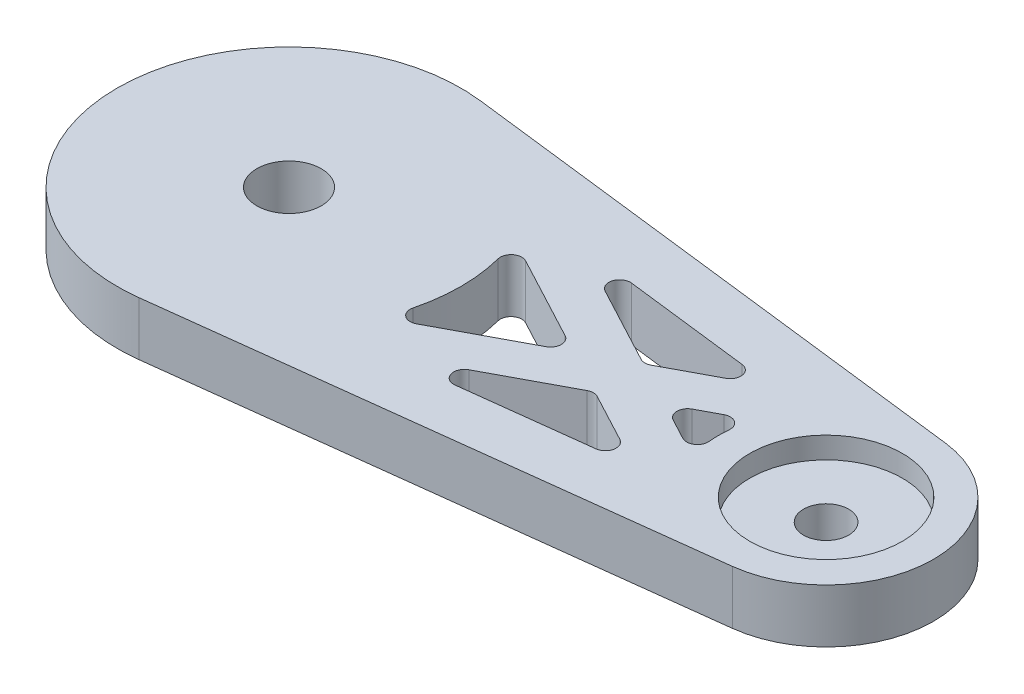
ISO-10303-21;
HEADER;
FILE_DESCRIPTION(('STEP AP214'),'2;1');
FILE_NAME('part.step','',(''),(''),'','','');
FILE_SCHEMA(('AUTOMOTIVE_DESIGN { 1 0 10303 214 1 1 1 1 }'));
ENDSEC;
DATA;
#1=APPLICATION_CONTEXT('core data for automotive mechanical design processes');
#2=APPLICATION_PROTOCOL_DEFINITION('international standard','automotive_design',2000,#1);
#3=PRODUCT_CONTEXT('',#1,'mechanical');
#4=PRODUCT('Part','Part','',(#3));
#5=PRODUCT_RELATED_PRODUCT_CATEGORY('part','',(#4));
#6=PRODUCT_DEFINITION_FORMATION('','',#4);
#7=PRODUCT_DEFINITION_CONTEXT('part definition',#1,'design');
#8=PRODUCT_DEFINITION('design','',#6,#7);
#9=PRODUCT_DEFINITION_SHAPE('','',#8);
#10=(LENGTH_UNIT() NAMED_UNIT(*) SI_UNIT(.MILLI.,.METRE.));
#11=(NAMED_UNIT(*) PLANE_ANGLE_UNIT() SI_UNIT($,.RADIAN.));
#12=(NAMED_UNIT(*) SI_UNIT($,.STERADIAN.) SOLID_ANGLE_UNIT());
#13=UNCERTAINTY_MEASURE_WITH_UNIT(LENGTH_MEASURE(1.E-05),#10,'distance_accuracy_value','');
#14=(GEOMETRIC_REPRESENTATION_CONTEXT(3) GLOBAL_UNCERTAINTY_ASSIGNED_CONTEXT((#13)) GLOBAL_UNIT_ASSIGNED_CONTEXT((#10,
#11,#12)) REPRESENTATION_CONTEXT('',''));
#15=CARTESIAN_POINT('',(0.,0.,0.));
#16=DIRECTION('',(0.,0.,1.));
#17=DIRECTION('',(1.,0.,0.));
#18=AXIS2_PLACEMENT_3D('',#15,#16,#17);
#19=CARTESIAN_POINT('',(1.92,5.,15.8843822668683));
#20=DIRECTION('',(-0.12,0.,-0.992773891679269));
#21=DIRECTION('',(-0.992773891679269,0.,0.12));
#22=AXIS2_PLACEMENT_3D('',#19,#20,#21);
#23=PLANE('',#22);
#24=DIRECTION('',(0.992773891679269,0.,-0.12));
#25=VECTOR('',#24,1.);
#26=CARTESIAN_POINT('',(1.92,0.,15.8843822668683));
#27=LINE('',#26,#25);
#28=CARTESIAN_POINT('',(1.92,0.,15.8843822668683));
#29=VERTEX_POINT('',#28);
#30=CARTESIAN_POINT('',(51.2,0.,9.92773891679268));
#31=VERTEX_POINT('',#30);
#32=EDGE_CURVE('E258',#29,#31,#27,.T.);
#33=ORIENTED_EDGE('',*,*,#32,.T.);
#34=DIRECTION('',(0.,-1.,0.));
#35=VECTOR('',#34,1.);
#36=CARTESIAN_POINT('',(51.2,5.,9.92773891679268));
#37=LINE('',#36,#35);
#38=CARTESIAN_POINT('',(51.2,5.,9.92773891679268));
#39=VERTEX_POINT('',#38);
#40=EDGE_CURVE('E237',#39,#31,#37,.T.);
#41=ORIENTED_EDGE('',*,*,#40,.F.);
#42=DIRECTION('',(0.992773891679269,0.,-0.12));
#43=VECTOR('',#42,1.);
#44=CARTESIAN_POINT('',(1.92,5.,15.8843822668683));
#45=LINE('',#44,#43);
#46=CARTESIAN_POINT('',(1.92,5.,15.8843822668683));
#47=VERTEX_POINT('',#46);
#48=EDGE_CURVE('E245',#47,#39,#45,.T.);
#49=ORIENTED_EDGE('',*,*,#48,.F.);
#50=DIRECTION('',(0.,-1.,0.));
#51=VECTOR('',#50,1.);
#52=CARTESIAN_POINT('',(1.92,5.,15.8843822668683));
#53=LINE('',#52,#51);
#54=EDGE_CURVE('E496',#47,#29,#53,.T.);
#55=ORIENTED_EDGE('',*,*,#54,.T.);
#56=EDGE_LOOP('',(#33,#41,#49,#55));
#57=FACE_BOUND('',#56,.T.);
#58=ADVANCED_FACE('F45',(#57),#23,.F.);
#59=CARTESIAN_POINT('',(50.,5.,0.));
#60=DIRECTION('',(0.,-1.,0.));
#61=DIRECTION('',(0.,0.,-1.));
#62=AXIS2_PLACEMENT_3D('',#59,#60,#61);
#63=CYLINDRICAL_SURFACE('',#62,10.);
#64=CARTESIAN_POINT('',(50.,0.,0.));
#65=DIRECTION('',(0.,1.,0.));
#66=DIRECTION('',(0.,0.,1.));
#67=AXIS2_PLACEMENT_3D('',#64,#65,#66);
#68=CIRCLE('',#67,10.);
#69=CARTESIAN_POINT('',(51.2,0.,-9.92773891679269));
#70=VERTEX_POINT('',#69);
#71=EDGE_CURVE('E545',#31,#70,#68,.T.);
#72=ORIENTED_EDGE('',*,*,#71,.T.);
#73=DIRECTION('',(0.,-1.,0.));
#74=VECTOR('',#73,1.);
#75=CARTESIAN_POINT('',(51.2,5.,-9.92773891679269));
#76=LINE('',#75,#74);
#77=CARTESIAN_POINT('',(51.2,5.,-9.92773891679269));
#78=VERTEX_POINT('',#77);
#79=EDGE_CURVE('E239',#78,#70,#76,.T.);
#80=ORIENTED_EDGE('',*,*,#79,.F.);
#81=CARTESIAN_POINT('',(50.,5.,0.));
#82=DIRECTION('',(0.,1.,0.));
#83=DIRECTION('',(0.,0.,1.));
#84=AXIS2_PLACEMENT_3D('',#81,#82,#83);
#85=CIRCLE('',#84,10.);
#86=EDGE_CURVE('E232',#39,#78,#85,.T.);
#87=ORIENTED_EDGE('',*,*,#86,.F.);
#88=ORIENTED_EDGE('',*,*,#40,.T.);
#89=EDGE_LOOP('',(#72,#80,#87,#88));
#90=FACE_BOUND('',#89,.T.);
#91=ADVANCED_FACE('F235',(#90),#63,.T.);
#92=CARTESIAN_POINT('',(1.92,5.,-15.8843822668683));
#93=DIRECTION('',(0.12,0.,-0.992773891679269));
#94=DIRECTION('',(-0.992773891679269,0.,-0.12));
#95=AXIS2_PLACEMENT_3D('',#92,#93,#94);
#96=PLANE('',#95);
#97=DIRECTION('',(0.992773891679269,0.,0.12));
#98=VECTOR('',#97,1.);
#99=CARTESIAN_POINT('',(1.92,0.,-15.8843822668683));
#100=LINE('',#99,#98);
#101=CARTESIAN_POINT('',(1.92,0.,-15.8843822668683));
#102=VERTEX_POINT('',#101);
#103=EDGE_CURVE('E548',#102,#70,#100,.T.);
#104=ORIENTED_EDGE('',*,*,#103,.F.);
#105=DIRECTION('',(0.,-1.,0.));
#106=VECTOR('',#105,1.);
#107=CARTESIAN_POINT('',(1.92,5.,-15.8843822668683));
#108=LINE('',#107,#106);
#109=CARTESIAN_POINT('',(1.92,5.,-15.8843822668683));
#110=VERTEX_POINT('',#109);
#111=EDGE_CURVE('E267',#110,#102,#108,.T.);
#112=ORIENTED_EDGE('',*,*,#111,.F.);
#113=DIRECTION('',(0.992773891679269,0.,0.12));
#114=VECTOR('',#113,1.);
#115=CARTESIAN_POINT('',(1.92,5.,-15.8843822668683));
#116=LINE('',#115,#114);
#117=EDGE_CURVE('E244',#110,#78,#116,.T.);
#118=ORIENTED_EDGE('',*,*,#117,.T.);
#119=ORIENTED_EDGE('',*,*,#79,.T.);
#120=EDGE_LOOP('',(#104,#112,#118,#119));
#121=FACE_BOUND('',#120,.T.);
#122=ADVANCED_FACE('F564',(#121),#96,.T.);
#123=CARTESIAN_POINT('',(5.85509273194591,5.,10.9895441071888));
#124=DIRECTION('',(-0.470213208590282,0.,-0.882552853072966));
#125=DIRECTION('',(-0.882552853072966,0.,0.470213208590282));
#126=AXIS2_PLACEMENT_3D('',#123,#124,#125);
#127=PLANE('',#126);
#128=DIRECTION('',(0.882552853072966,0.,-0.470213208590282));
#129=VECTOR('',#128,1.);
#130=CARTESIAN_POINT('',(5.85509273194591,0.,10.9895441071888));
#131=LINE('',#130,#129);
#132=CARTESIAN_POINT('',(31.2051972154841,0.,-2.51667699424358));
#133=VERTEX_POINT('',#132);
#134=CARTESIAN_POINT('',(35.7312644808302,0.,-4.92810946961721));
#135=VERTEX_POINT('',#134);
#136=EDGE_CURVE('E531',#133,#135,#131,.T.);
#137=ORIENTED_EDGE('',*,*,#136,.F.);
#138=DIRECTION('',(0.,-1.,0.));
#139=VECTOR('',#138,1.);
#140=CARTESIAN_POINT('',(31.2051972154841,5.,-2.51667699424358));
#141=LINE('',#140,#139);
#142=CARTESIAN_POINT('',(31.2051972154841,5.,-2.51667699424358));
#143=VERTEX_POINT('',#142);
#144=EDGE_CURVE('E366',#133,#143,#141,.F.);
#145=ORIENTED_EDGE('',*,*,#144,.T.);
#146=DIRECTION('',(0.882552853072966,0.,-0.470213208590282));
#147=VECTOR('',#146,1.);
#148=CARTESIAN_POINT('',(5.85509273194591,5.,10.9895441071888));
#149=LINE('',#148,#147);
#150=CARTESIAN_POINT('',(35.7312644808302,5.,-4.92810946961721));
#151=VERTEX_POINT('',#150);
#152=EDGE_CURVE('E477',#143,#151,#149,.T.);
#153=ORIENTED_EDGE('',*,*,#152,.T.);
#154=DIRECTION('',(0.,-1.,0.));
#155=VECTOR('',#154,1.);
#156=CARTESIAN_POINT('',(35.7312644808302,5.,-4.9281094696172));
#157=LINE('',#156,#155);
#158=EDGE_CURVE('E362',#151,#135,#157,.T.);
#159=ORIENTED_EDGE('',*,*,#158,.T.);
#160=EDGE_LOOP('',(#137,#145,#153,#159));
#161=FACE_BOUND('',#160,.T.);
#162=ADVANCED_FACE('F566',(#161),#127,.T.);
#163=CARTESIAN_POINT('',(7.73594556630704,5.,-14.5197555194806));
#164=DIRECTION('',(0.470213208590282,0.,-0.882552853072966));
#165=DIRECTION('',(-0.882552853072966,0.,-0.470213208590282));
#166=AXIS2_PLACEMENT_3D('',#163,#164,#165);
#167=PLANE('',#166);
#168=DIRECTION('',(0.882552853072966,0.,0.470213208590282));
#169=VECTOR('',#168,1.);
#170=CARTESIAN_POINT('',(7.73594556630704,0.,-14.5197555194806));
#171=LINE('',#170,#169);
#172=CARTESIAN_POINT('',(23.0824153449946,0.,-6.3433468544985));
#173=VERTEX_POINT('',#172);
#174=CARTESIAN_POINT('',(30.2647707983036,0.,-2.51667699424358));
#175=VERTEX_POINT('',#174);
#176=EDGE_CURVE('E535',#173,#175,#171,.T.);
#177=ORIENTED_EDGE('',*,*,#176,.F.);
#178=DIRECTION('',(0.,-1.,0.));
#179=VECTOR('',#178,1.);
#180=CARTESIAN_POINT('',(23.0824153449946,5.,-6.3433468544985));
#181=LINE('',#180,#179);
#182=CARTESIAN_POINT('',(23.0824153449946,5.,-6.3433468544985));
#183=VERTEX_POINT('',#182);
#184=EDGE_CURVE('E359',#173,#183,#181,.F.);
#185=ORIENTED_EDGE('',*,*,#184,.T.);
#186=DIRECTION('',(0.882552853072966,0.,0.470213208590282));
#187=VECTOR('',#186,1.);
#188=CARTESIAN_POINT('',(7.73594556630704,5.,-14.5197555194806));
#189=LINE('',#188,#187);
#190=CARTESIAN_POINT('',(30.2647707983036,5.,-2.51667699424358));
#191=VERTEX_POINT('',#190);
#192=EDGE_CURVE('E481',#183,#191,#189,.T.);
#193=ORIENTED_EDGE('',*,*,#192,.T.);
#194=DIRECTION('',(0.,-1.,0.));
#195=VECTOR('',#194,1.);
#196=CARTESIAN_POINT('',(30.2647707983036,0.,-2.51667699424358));
#197=LINE('',#196,#195);
#198=EDGE_CURVE('E355',#191,#175,#197,.T.);
#199=ORIENTED_EDGE('',*,*,#198,.T.);
#200=EDGE_LOOP('',(#177,#185,#193,#199));
#201=FACE_BOUND('',#200,.T.);
#202=ADVANCED_FACE('F572',(#201),#167,.T.);
#203=CARTESIAN_POINT('',(7.73594556630704,5.,14.5197555194806));
#204=DIRECTION('',(-0.470213208590282,0.,-0.882552853072966));
#205=DIRECTION('',(-0.882552853072966,0.,0.470213208590282));
#206=AXIS2_PLACEMENT_3D('',#203,#204,#205);
#207=PLANE('',#206);
#208=DIRECTION('',(0.882552853072966,0.,-0.470213208590282));
#209=VECTOR('',#208,1.);
#210=CARTESIAN_POINT('',(7.73594556630704,0.,14.5197555194806));
#211=LINE('',#210,#209);
#212=CARTESIAN_POINT('',(23.0824153449946,0.,6.3433468544985));
#213=VERTEX_POINT('',#212);
#214=CARTESIAN_POINT('',(30.2647707983036,0.,2.51667699424358));
#215=VERTEX_POINT('',#214);
#216=EDGE_CURVE('E519',#213,#215,#211,.T.);
#217=ORIENTED_EDGE('',*,*,#216,.T.);
#218=DIRECTION('',(0.,-1.,0.));
#219=VECTOR('',#218,1.);
#220=CARTESIAN_POINT('',(30.2647707983036,5.,2.51667699424359));
#221=LINE('',#220,#219);
#222=CARTESIAN_POINT('',(30.2647707983036,5.,2.51667699424358));
#223=VERTEX_POINT('',#222);
#224=EDGE_CURVE('E320',#215,#223,#221,.F.);
#225=ORIENTED_EDGE('',*,*,#224,.T.);
#226=DIRECTION('',(0.882552853072966,0.,-0.470213208590282));
#227=VECTOR('',#226,1.);
#228=CARTESIAN_POINT('',(7.73594556630704,5.,14.5197555194806));
#229=LINE('',#228,#227);
#230=CARTESIAN_POINT('',(23.0824153449946,5.,6.3433468544985));
#231=VERTEX_POINT('',#230);
#232=EDGE_CURVE('E465',#231,#223,#229,.T.);
#233=ORIENTED_EDGE('',*,*,#232,.F.);
#234=DIRECTION('',(0.,-1.,0.));
#235=VECTOR('',#234,1.);
#236=CARTESIAN_POINT('',(23.0824153449946,5.,6.3433468544985));
#237=LINE('',#236,#235);
#238=EDGE_CURVE('E316',#231,#213,#237,.T.);
#239=ORIENTED_EDGE('',*,*,#238,.T.);
#240=EDGE_LOOP('',(#217,#225,#233,#239));
#241=FACE_BOUND('',#240,.T.);
#242=ADVANCED_FACE('F592',(#241),#207,.F.);
#243=CARTESIAN_POINT('',(5.85509273194591,5.,-10.9895441071887));
#244=DIRECTION('',(0.470213208590282,0.,-0.882552853072966));
#245=DIRECTION('',(-0.882552853072966,0.,-0.470213208590282));
#246=AXIS2_PLACEMENT_3D('',#243,#244,#245);
#247=PLANE('',#246);
#248=DIRECTION('',(0.882552853072966,0.,0.470213208590282));
#249=VECTOR('',#248,1.);
#250=CARTESIAN_POINT('',(5.85509273194591,5.,-10.9895441071887));
#251=LINE('',#250,#249);
#252=CARTESIAN_POINT('',(31.2051972154841,5.,2.51667699424359));
#253=VERTEX_POINT('',#252);
#254=CARTESIAN_POINT('',(35.7312644808301,5.,4.9281094696172));
#255=VERTEX_POINT('',#254);
#256=EDGE_CURVE('E469',#253,#255,#251,.T.);
#257=ORIENTED_EDGE('',*,*,#256,.F.);
#258=DIRECTION('',(0.,-1.,0.));
#259=VECTOR('',#258,1.);
#260=CARTESIAN_POINT('',(31.2051972154841,0.,2.51667699424358));
#261=LINE('',#260,#259);
#262=CARTESIAN_POINT('',(31.2051972154841,0.,2.51667699424359));
#263=VERTEX_POINT('',#262);
#264=EDGE_CURVE('E312',#253,#263,#261,.T.);
#265=ORIENTED_EDGE('',*,*,#264,.T.);
#266=DIRECTION('',(0.882552853072966,0.,0.470213208590282));
#267=VECTOR('',#266,1.);
#268=CARTESIAN_POINT('',(5.85509273194591,0.,-10.9895441071887));
#269=LINE('',#268,#267);
#270=CARTESIAN_POINT('',(35.7312644808301,0.,4.9281094696172));
#271=VERTEX_POINT('',#270);
#272=EDGE_CURVE('E523',#263,#271,#269,.T.);
#273=ORIENTED_EDGE('',*,*,#272,.T.);
#274=DIRECTION('',(0.,-1.,0.));
#275=VECTOR('',#274,1.);
#276=CARTESIAN_POINT('',(35.7312644808301,5.,4.9281094696172));
#277=LINE('',#276,#275);
#278=EDGE_CURVE('E309',#271,#255,#277,.F.);
#279=ORIENTED_EDGE('',*,*,#278,.T.);
#280=EDGE_LOOP('',(#257,#265,#273,#279));
#281=FACE_BOUND('',#280,.T.);
#282=ADVANCED_FACE('F599',(#281),#247,.F.);
#283=CARTESIAN_POINT('',(7.73594556630702,5.,14.5197555194806));
#284=DIRECTION('',(-0.470213208590281,0.,-0.882552853072966));
#285=DIRECTION('',(-0.882552853072966,0.,0.470213208590281));
#286=AXIS2_PLACEMENT_3D('',#283,#284,#285);
#287=PLANE('',#286);
#288=DIRECTION('',(0.882552853072966,0.,-0.470213208590281));
#289=VECTOR('',#288,1.);
#290=CARTESIAN_POINT('',(7.73594556630702,5.,14.5197555194806));
#291=LINE('',#290,#289);
#292=CARTESIAN_POINT('',(36.6448552901751,5.,-0.882552853072977));
#293=VERTEX_POINT('',#292);
#294=CARTESIAN_POINT('',(38.5781173840263,5.,-1.91257090698391));
#295=VERTEX_POINT('',#294);
#296=EDGE_CURVE('E448',#293,#295,#291,.T.);
#297=ORIENTED_EDGE('',*,*,#296,.F.);
#298=DIRECTION('',(0.,-1.,0.));
#299=VECTOR('',#298,1.);
#300=CARTESIAN_POINT('',(36.6448552901751,5.,-0.882552853072975));
#301=LINE('',#300,#299);
#302=CARTESIAN_POINT('',(36.6448552901751,0.,-0.882552853072977));
#303=VERTEX_POINT('',#302);
#304=EDGE_CURVE('E273',#293,#303,#301,.T.);
#305=ORIENTED_EDGE('',*,*,#304,.T.);
#306=DIRECTION('',(0.882552853072966,0.,-0.470213208590281));
#307=VECTOR('',#306,1.);
#308=CARTESIAN_POINT('',(7.73594556630702,0.,14.5197555194806));
#309=LINE('',#308,#307);
#310=CARTESIAN_POINT('',(38.5781173840263,0.,-1.91257090698391));
#311=VERTEX_POINT('',#310);
#312=EDGE_CURVE('E507',#303,#311,#309,.T.);
#313=ORIENTED_EDGE('',*,*,#312,.T.);
#314=DIRECTION('',(0.,1.,0.));
#315=VECTOR('',#314,1.);
#316=CARTESIAN_POINT('',(38.5781173840263,5.,-1.9125709069839));
#317=LINE('',#316,#315);
#318=EDGE_CURVE('E265',#311,#295,#317,.T.);
#319=ORIENTED_EDGE('',*,*,#318,.T.);
#320=EDGE_LOOP('',(#297,#305,#313,#319));
#321=FACE_BOUND('',#320,.T.);
#322=ADVANCED_FACE('F602',(#321),#287,.F.);
#323=CARTESIAN_POINT('',(50.,5.,0.));
#324=DIRECTION('',(0.,-1.,0.));
#325=DIRECTION('',(0.,0.,-1.));
#326=AXIS2_PLACEMENT_3D('',#323,#324,#325);
#327=CYLINDRICAL_SURFACE('',#326,10.);
#328=CARTESIAN_POINT('',(50.,5.,0.));
#329=DIRECTION('',(0.,1.,0.));
#330=DIRECTION('',(0.,0.,1.));
#331=AXIS2_PLACEMENT_3D('',#328,#329,#330);
#332=CIRCLE('',#331,10.);
#333=CARTESIAN_POINT('',(40.0439369023787,5.,-0.936380049009941));
#334=VERTEX_POINT('',#333);
#335=CARTESIAN_POINT('',(40.0439369023787,5.,0.936380049009941));
#336=VERTEX_POINT('',#335);
#337=EDGE_CURVE('E457',#334,#336,#332,.T.);
#338=ORIENTED_EDGE('',*,*,#337,.F.);
#339=DIRECTION('',(0.,-1.,0.));
#340=VECTOR('',#339,1.);
#341=CARTESIAN_POINT('',(40.0439369023787,5.,-0.936380049009941));
#342=LINE('',#341,#340);
#343=CARTESIAN_POINT('',(40.0439369023787,0.,-0.936380049009941));
#344=VERTEX_POINT('',#343);
#345=EDGE_CURVE('E287',#334,#344,#342,.T.);
#346=ORIENTED_EDGE('',*,*,#345,.T.);
#347=CARTESIAN_POINT('',(50.,0.,0.));
#348=DIRECTION('',(0.,1.,0.));
#349=DIRECTION('',(0.,0.,1.));
#350=AXIS2_PLACEMENT_3D('',#347,#348,#349);
#351=CIRCLE('',#350,10.);
#352=CARTESIAN_POINT('',(40.0439369023787,0.,0.936380049009941));
#353=VERTEX_POINT('',#352);
#354=EDGE_CURVE('E511',#344,#353,#351,.T.);
#355=ORIENTED_EDGE('',*,*,#354,.T.);
#356=DIRECTION('',(0.,-1.,0.));
#357=VECTOR('',#356,1.);
#358=CARTESIAN_POINT('',(40.0439369023787,5.,0.936380049009941));
#359=LINE('',#358,#357);
#360=EDGE_CURVE('E284',#353,#336,#359,.F.);
#361=ORIENTED_EDGE('',*,*,#360,.T.);
#362=EDGE_LOOP('',(#338,#346,#355,#361));
#363=FACE_BOUND('',#362,.T.);
#364=ADVANCED_FACE('F611',(#363),#327,.T.);
#365=CARTESIAN_POINT('',(5.8550927319459,5.,10.9895441071887));
#366=DIRECTION('',(-0.470213208590282,0.,-0.882552853072966));
#367=DIRECTION('',(-0.882552853072966,0.,0.470213208590282));
#368=AXIS2_PLACEMENT_3D('',#365,#366,#367);
#369=PLANE('',#368);
#370=DIRECTION('',(0.882552853072966,0.,-0.470213208590282));
#371=VECTOR('',#370,1.);
#372=CARTESIAN_POINT('',(5.8550927319459,5.,10.9895441071887));
#373=LINE('',#372,#371);
#374=CARTESIAN_POINT('',(16.9434061477119,5.,5.08182831325323));
#375=VERTEX_POINT('',#374);
#376=CARTESIAN_POINT('',(24.8251127236126,5.,0.882552853072968));
#377=VERTEX_POINT('',#376);
#378=EDGE_CURVE('E439',#375,#377,#373,.T.);
#379=ORIENTED_EDGE('',*,*,#378,.T.);
#380=DIRECTION('',(0.,-1.,0.));
#381=VECTOR('',#380,1.);
#382=CARTESIAN_POINT('',(24.8251127236126,5.,0.882552853072968));
#383=LINE('',#382,#381);
#384=CARTESIAN_POINT('',(24.8251127236126,0.,0.882552853072968));
#385=VERTEX_POINT('',#384);
#386=EDGE_CURVE('E403',#377,#385,#383,.T.);
#387=ORIENTED_EDGE('',*,*,#386,.T.);
#388=DIRECTION('',(0.882552853072966,0.,-0.470213208590282));
#389=VECTOR('',#388,1.);
#390=CARTESIAN_POINT('',(5.8550927319459,0.,10.9895441071887));
#391=LINE('',#390,#389);
#392=CARTESIAN_POINT('',(16.9434061477119,0.,5.08182831325323));
#393=VERTEX_POINT('',#392);
#394=EDGE_CURVE('E423',#393,#385,#391,.T.);
#395=ORIENTED_EDGE('',*,*,#394,.F.);
#396=DIRECTION('',(0.,-1.,0.));
#397=VECTOR('',#396,1.);
#398=CARTESIAN_POINT('',(16.9434061477119,5.,5.08182831325323));
#399=LINE('',#398,#397);
#400=EDGE_CURVE('E68',#393,#375,#399,.F.);
#401=ORIENTED_EDGE('',*,*,#400,.T.);
#402=EDGE_LOOP('',(#379,#387,#395,#401));
#403=FACE_BOUND('',#402,.T.);
#404=ADVANCED_FACE('F428',(#403),#369,.T.);
#405=CARTESIAN_POINT('',(0.,5.,0.));
#406=DIRECTION('',(0.,-1.,0.));
#407=DIRECTION('',(0.,0.,-1.));
#408=AXIS2_PLACEMENT_3D('',#405,#406,#407);
#409=CYLINDRICAL_SURFACE('',#408,16.);
#410=CARTESIAN_POINT('',(0.,0.,0.));
#411=DIRECTION('',(0.,1.,0.));
#412=DIRECTION('',(0.,0.,1.));
#413=AXIS2_PLACEMENT_3D('',#410,#411,#412);
#414=CIRCLE('',#413,16.);
#415=CARTESIAN_POINT('',(15.5041815897616,0.,3.95225925664024));
#416=VERTEX_POINT('',#415);
#417=CARTESIAN_POINT('',(15.5041815897616,0.,-3.95225925664025));
#418=VERTEX_POINT('',#417);
#419=EDGE_CURVE('E425',#416,#418,#414,.T.);
#420=ORIENTED_EDGE('',*,*,#419,.T.);
#421=DIRECTION('',(0.,-1.,0.));
#422=VECTOR('',#421,1.);
#423=CARTESIAN_POINT('',(15.5041815897616,5.,-3.95225925664025));
#424=LINE('',#423,#422);
#425=CARTESIAN_POINT('',(15.5041815897616,5.,-3.95225925664025));
#426=VERTEX_POINT('',#425);
#427=EDGE_CURVE('E398',#418,#426,#424,.F.);
#428=ORIENTED_EDGE('',*,*,#427,.T.);
#429=CARTESIAN_POINT('',(0.,5.,0.));
#430=DIRECTION('',(0.,1.,0.));
#431=DIRECTION('',(0.,0.,1.));
#432=AXIS2_PLACEMENT_3D('',#429,#430,#431);
#433=CIRCLE('',#432,16.);
#434=CARTESIAN_POINT('',(15.5041815897616,5.,3.95225925664024));
#435=VERTEX_POINT('',#434);
#436=EDGE_CURVE('E437',#435,#426,#433,.T.);
#437=ORIENTED_EDGE('',*,*,#436,.F.);
#438=DIRECTION('',(0.,-1.,0.));
#439=VECTOR('',#438,1.);
#440=CARTESIAN_POINT('',(15.5041815897616,5.,3.95225925664024));
#441=LINE('',#440,#439);
#442=EDGE_CURVE('E394',#435,#416,#441,.T.);
#443=ORIENTED_EDGE('',*,*,#442,.T.);
#444=EDGE_LOOP('',(#420,#428,#437,#443));
#445=FACE_BOUND('',#444,.T.);
#446=ADVANCED_FACE('F441',(#445),#409,.T.);
#447=CARTESIAN_POINT('',(50.,5.,0.));
#448=DIRECTION('',(0.,-1.,0.));
#449=DIRECTION('',(0.,0.,-1.));
#450=AXIS2_PLACEMENT_3D('',#447,#448,#449);
#451=CYLINDRICAL_SURFACE('',#450,7.1);
#452=CARTESIAN_POINT('',(50.,3.,0.));
#453=DIRECTION('',(0.,1.,0.));
#454=DIRECTION('',(0.,0.,1.));
#455=AXIS2_PLACEMENT_3D('',#452,#453,#454);
#456=CIRCLE('',#455,7.1);
#457=CARTESIAN_POINT('',(50.,3.,7.1));
#458=VERTEX_POINT('',#457);
#459=EDGE_CURVE('E260',#458,#458,#456,.T.);
#460=ORIENTED_EDGE('',*,*,#459,.F.);
#461=EDGE_LOOP('',(#460));
#462=FACE_BOUND('',#461,.T.);
#463=CARTESIAN_POINT('',(50.,5.,0.));
#464=DIRECTION('',(0.,1.,0.));
#465=DIRECTION('',(0.,0.,1.));
#466=AXIS2_PLACEMENT_3D('',#463,#464,#465);
#467=CIRCLE('',#466,7.1);
#468=CARTESIAN_POINT('',(50.,5.,7.1));
#469=VERTEX_POINT('',#468);
#470=EDGE_CURVE('E255',#469,#469,#467,.T.);
#471=ORIENTED_EDGE('',*,*,#470,.T.);
#472=EDGE_LOOP('',(#471));
#473=FACE_BOUND('',#472,.T.);
#474=ADVANCED_FACE('F582',(#462,#473),#451,.F.);
#475=CARTESIAN_POINT('',(1.32,5.,-10.920512808472));
#476=DIRECTION('',(0.12,0.,-0.992773891679269));
#477=DIRECTION('',(-0.992773891679269,0.,-0.12));
#478=AXIS2_PLACEMENT_3D('',#475,#476,#477);
#479=PLANE('',#478);
#480=DIRECTION('',(0.992773891679269,0.,0.12));
#481=VECTOR('',#480,1.);
#482=CARTESIAN_POINT('',(1.32,5.,-10.920512808472));
#483=LINE('',#482,#481);
#484=CARTESIAN_POINT('',(23.6726285535849,5.,-8.21867359925073));
#485=VERTEX_POINT('',#484);
#486=CARTESIAN_POINT('',(35.3810512722399,5.,-6.80343621436944));
#487=VERTEX_POINT('',#486);
#488=EDGE_CURVE('E485',#485,#487,#483,.T.);
#489=ORIENTED_EDGE('',*,*,#488,.F.);
#490=DIRECTION('',(0.,-1.,0.));
#491=VECTOR('',#490,1.);
#492=CARTESIAN_POINT('',(23.6726285535849,5.,-8.21867359925073));
#493=LINE('',#492,#491);
#494=CARTESIAN_POINT('',(23.6726285535849,0.,-8.21867359925073));
#495=VERTEX_POINT('',#494);
#496=EDGE_CURVE('E351',#485,#495,#493,.T.);
#497=ORIENTED_EDGE('',*,*,#496,.T.);
#498=DIRECTION('',(0.992773891679269,0.,0.12));
#499=VECTOR('',#498,1.);
#500=CARTESIAN_POINT('',(1.32,0.,-10.920512808472));
#501=LINE('',#500,#499);
#502=CARTESIAN_POINT('',(35.3810512722399,0.,-6.80343621436944));
#503=VERTEX_POINT('',#502);
#504=EDGE_CURVE('E539',#495,#503,#501,.T.);
#505=ORIENTED_EDGE('',*,*,#504,.T.);
#506=DIRECTION('',(0.,-1.,0.));
#507=VECTOR('',#506,1.);
#508=CARTESIAN_POINT('',(35.3810512722399,5.,-6.80343621436944));
#509=LINE('',#508,#507);
#510=EDGE_CURVE('E348',#503,#487,#509,.F.);
#511=ORIENTED_EDGE('',*,*,#510,.T.);
#512=EDGE_LOOP('',(#489,#497,#505,#511));
#513=FACE_BOUND('',#512,.T.);
#514=ADVANCED_FACE('F585',(#513),#479,.F.);
#515=CARTESIAN_POINT('',(1.32,5.,10.920512808472));
#516=DIRECTION('',(-0.12,0.,-0.992773891679269));
#517=DIRECTION('',(-0.992773891679269,0.,0.12));
#518=AXIS2_PLACEMENT_3D('',#515,#516,#517);
#519=PLANE('',#518);
#520=DIRECTION('',(0.992773891679269,0.,-0.12));
#521=VECTOR('',#520,1.);
#522=CARTESIAN_POINT('',(1.32,0.,10.920512808472));
#523=LINE('',#522,#521);
#524=CARTESIAN_POINT('',(23.6726285535849,0.,8.21867359925074));
#525=VERTEX_POINT('',#524);
#526=CARTESIAN_POINT('',(35.3810512722399,0.,6.80343621436944));
#527=VERTEX_POINT('',#526);
#528=EDGE_CURVE('E527',#525,#527,#523,.T.);
#529=ORIENTED_EDGE('',*,*,#528,.F.);
#530=DIRECTION('',(0.,-1.,0.));
#531=VECTOR('',#530,1.);
#532=CARTESIAN_POINT('',(23.6726285535849,5.,8.21867359925074));
#533=LINE('',#532,#531);
#534=CARTESIAN_POINT('',(23.6726285535849,5.,8.21867359925074));
#535=VERTEX_POINT('',#534);
#536=EDGE_CURVE('E327',#525,#535,#533,.F.);
#537=ORIENTED_EDGE('',*,*,#536,.T.);
#538=DIRECTION('',(0.992773891679269,0.,-0.12));
#539=VECTOR('',#538,1.);
#540=CARTESIAN_POINT('',(1.32,5.,10.920512808472));
#541=LINE('',#540,#539);
#542=CARTESIAN_POINT('',(35.3810512722399,5.,6.80343621436944));
#543=VERTEX_POINT('',#542);
#544=EDGE_CURVE('E473',#535,#543,#541,.T.);
#545=ORIENTED_EDGE('',*,*,#544,.T.);
#546=DIRECTION('',(0.,-1.,0.));
#547=VECTOR('',#546,1.);
#548=CARTESIAN_POINT('',(35.3810512722399,5.,6.80343621436944));
#549=LINE('',#548,#547);
#550=EDGE_CURVE('E323',#543,#527,#549,.T.);
#551=ORIENTED_EDGE('',*,*,#550,.T.);
#552=EDGE_LOOP('',(#529,#537,#545,#551));
#553=FACE_BOUND('',#552,.T.);
#554=ADVANCED_FACE('F589',(#553),#519,.T.);
#555=CARTESIAN_POINT('',(7.73594556630704,5.,-14.5197555194806));
#556=DIRECTION('',(0.470213208590282,0.,-0.882552853072966));
#557=DIRECTION('',(-0.882552853072966,0.,-0.470213208590282));
#558=AXIS2_PLACEMENT_3D('',#555,#556,#557);
#559=PLANE('',#558);
#560=DIRECTION('',(0.882552853072966,0.,0.470213208590282));
#561=VECTOR('',#560,1.);
#562=CARTESIAN_POINT('',(7.73594556630704,0.,-14.5197555194806));
#563=LINE('',#562,#561);
#564=CARTESIAN_POINT('',(36.6448552901751,0.,0.882552853072972));
#565=VERTEX_POINT('',#564);
#566=CARTESIAN_POINT('',(38.5781173840263,0.,1.91257090698391));
#567=VERTEX_POINT('',#566);
#568=EDGE_CURVE('E515',#565,#567,#563,.T.);
#569=ORIENTED_EDGE('',*,*,#568,.F.);
#570=DIRECTION('',(0.,-1.,0.));
#571=VECTOR('',#570,1.);
#572=CARTESIAN_POINT('',(36.6448552901751,5.,0.882552853072963));
#573=LINE('',#572,#571);
#574=CARTESIAN_POINT('',(36.6448552901751,5.,0.882552853072972));
#575=VERTEX_POINT('',#574);
#576=EDGE_CURVE('E281',#565,#575,#573,.F.);
#577=ORIENTED_EDGE('',*,*,#576,.T.);
#578=DIRECTION('',(0.882552853072966,0.,0.470213208590282));
#579=VECTOR('',#578,1.);
#580=CARTESIAN_POINT('',(7.73594556630704,5.,-14.5197555194806));
#581=LINE('',#580,#579);
#582=CARTESIAN_POINT('',(38.5781173840263,5.,1.91257090698391));
#583=VERTEX_POINT('',#582);
#584=EDGE_CURVE('E461',#575,#583,#581,.T.);
#585=ORIENTED_EDGE('',*,*,#584,.T.);
#586=DIRECTION('',(0.,-1.,0.));
#587=VECTOR('',#586,1.);
#588=CARTESIAN_POINT('',(38.5781173840263,5.,1.9125709069839));
#589=LINE('',#588,#587);
#590=EDGE_CURVE('E277',#583,#567,#589,.T.);
#591=ORIENTED_EDGE('',*,*,#590,.T.);
#592=EDGE_LOOP('',(#569,#577,#585,#591));
#593=FACE_BOUND('',#592,.T.);
#594=ADVANCED_FACE('F597',(#593),#559,.T.);
#595=CARTESIAN_POINT('',(5.85509273194591,5.,-10.9895441071888));
#596=DIRECTION('',(0.470213208590282,0.,-0.882552853072966));
#597=DIRECTION('',(-0.882552853072966,0.,-0.470213208590282));
#598=AXIS2_PLACEMENT_3D('',#595,#596,#597);
#599=PLANE('',#598);
#600=DIRECTION('',(0.882552853072966,0.,0.470213208590282));
#601=VECTOR('',#600,1.);
#602=CARTESIAN_POINT('',(5.85509273194591,5.,-10.9895441071888));
#603=LINE('',#602,#601);
#604=CARTESIAN_POINT('',(16.9434061477119,5.,-5.08182831325323));
#605=VERTEX_POINT('',#604);
#606=CARTESIAN_POINT('',(24.8251127236126,5.,-0.882552853072963));
#607=VERTEX_POINT('',#606);
#608=EDGE_CURVE('E444',#605,#607,#603,.T.);
#609=ORIENTED_EDGE('',*,*,#608,.F.);
#610=DIRECTION('',(0.,1.,0.));
#611=VECTOR('',#610,1.);
#612=CARTESIAN_POINT('',(16.9434061477119,0.,-5.08182831325323));
#613=LINE('',#612,#611);
#614=CARTESIAN_POINT('',(16.9434061477119,0.,-5.08182831325323));
#615=VERTEX_POINT('',#614);
#616=EDGE_CURVE('E390',#605,#615,#613,.F.);
#617=ORIENTED_EDGE('',*,*,#616,.T.);
#618=DIRECTION('',(0.882552853072966,0.,0.470213208590282));
#619=VECTOR('',#618,1.);
#620=CARTESIAN_POINT('',(5.85509273194591,0.,-10.9895441071888));
#621=LINE('',#620,#619);
#622=CARTESIAN_POINT('',(24.8251127236126,0.,-0.882552853072963));
#623=VERTEX_POINT('',#622);
#624=EDGE_CURVE('E503',#615,#623,#621,.T.);
#625=ORIENTED_EDGE('',*,*,#624,.T.);
#626=DIRECTION('',(0.,-1.,0.));
#627=VECTOR('',#626,1.);
#628=CARTESIAN_POINT('',(24.8251127236126,5.,-0.882552853072966));
#629=LINE('',#628,#627);
#630=EDGE_CURVE('E387',#623,#607,#629,.F.);
#631=ORIENTED_EDGE('',*,*,#630,.T.);
#632=EDGE_LOOP('',(#609,#617,#625,#631));
#633=FACE_BOUND('',#632,.T.);
#634=ADVANCED_FACE('F609',(#633),#599,.F.);
#635=CARTESIAN_POINT('',(0.,5.,0.));
#636=DIRECTION('',(0.,-1.,0.));
#637=DIRECTION('',(0.,0.,-1.));
#638=AXIS2_PLACEMENT_3D('',#635,#636,#637);
#639=CYLINDRICAL_SURFACE('',#638,3.);
#640=CARTESIAN_POINT('',(0.,5.,0.));
#641=DIRECTION('',(0.,1.,0.));
#642=DIRECTION('',(0.,0.,1.));
#643=AXIS2_PLACEMENT_3D('',#640,#641,#642);
#644=CIRCLE('',#643,3.);
#645=CARTESIAN_POINT('',(0.,5.,3.));
#646=VERTEX_POINT('',#645);
#647=EDGE_CURVE('E450',#646,#646,#644,.T.);
#648=ORIENTED_EDGE('',*,*,#647,.T.);
#649=EDGE_LOOP('',(#648));
#650=FACE_BOUND('',#649,.T.);
#651=CARTESIAN_POINT('',(0.,0.,0.));
#652=DIRECTION('',(0.,1.,0.));
#653=DIRECTION('',(0.,0.,1.));
#654=AXIS2_PLACEMENT_3D('',#651,#652,#653);
#655=CIRCLE('',#654,3.);
#656=CARTESIAN_POINT('',(0.,0.,3.));
#657=VERTEX_POINT('',#656);
#658=EDGE_CURVE('E431',#657,#657,#655,.T.);
#659=ORIENTED_EDGE('',*,*,#658,.F.);
#660=EDGE_LOOP('',(#659));
#661=FACE_BOUND('',#660,.T.);
#662=ADVANCED_FACE('F620',(#650,#661),#639,.F.);
#663=CARTESIAN_POINT('',(0.,5.,0.));
#664=DIRECTION('',(0.,-1.,0.));
#665=DIRECTION('',(0.,0.,-1.));
#666=AXIS2_PLACEMENT_3D('',#663,#664,#665);
#667=CYLINDRICAL_SURFACE('',#666,16.);
#668=CARTESIAN_POINT('',(0.,0.,0.));
#669=DIRECTION('',(0.,1.,0.));
#670=DIRECTION('',(0.,0.,1.));
#671=AXIS2_PLACEMENT_3D('',#668,#669,#670);
#672=CIRCLE('',#671,16.);
#673=EDGE_CURVE('E552',#102,#29,#672,.T.);
#674=ORIENTED_EDGE('',*,*,#673,.T.);
#675=ORIENTED_EDGE('',*,*,#54,.F.);
#676=CARTESIAN_POINT('',(0.,5.,0.));
#677=DIRECTION('',(0.,1.,0.));
#678=DIRECTION('',(0.,0.,1.));
#679=AXIS2_PLACEMENT_3D('',#676,#677,#678);
#680=CIRCLE('',#679,16.);
#681=EDGE_CURVE('E250',#110,#47,#680,.T.);
#682=ORIENTED_EDGE('',*,*,#681,.F.);
#683=ORIENTED_EDGE('',*,*,#111,.T.);
#684=EDGE_LOOP('',(#674,#675,#682,#683));
#685=FACE_BOUND('',#684,.T.);
#686=ADVANCED_FACE('F559',(#685),#667,.T.);
#687=CARTESIAN_POINT('',(0.,5.,0.));
#688=DIRECTION('',(0.,1.,0.));
#689=DIRECTION('',(0.,0.,1.));
#690=AXIS2_PLACEMENT_3D('',#687,#688,#689);
#691=PLANE('',#690);
#692=ORIENTED_EDGE('',*,*,#647,.F.);
#693=EDGE_LOOP('',(#692));
#694=FACE_BOUND('',#693,.T.);
#695=ORIENTED_EDGE('',*,*,#378,.F.);
#696=CARTESIAN_POINT('',(16.4731929391217,5.,4.19927546018026));
#697=DIRECTION('',(0.,1.,0.));
#698=DIRECTION('',(0.,0.,1.));
#699=AXIS2_PLACEMENT_3D('',#696,#697,#698);
#700=CIRCLE('',#699,1.);
#701=EDGE_CURVE('E11',#375,#435,#700,.F.);
#702=ORIENTED_EDGE('',*,*,#701,.T.);
#703=ORIENTED_EDGE('',*,*,#436,.T.);
#704=CARTESIAN_POINT('',(16.4731929391217,5.,-4.19927546018027));
#705=DIRECTION('',(0.,1.,0.));
#706=DIRECTION('',(0.,0.,1.));
#707=AXIS2_PLACEMENT_3D('',#704,#705,#706);
#708=CIRCLE('',#707,1.);
#709=EDGE_CURVE('E410',#426,#605,#708,.F.);
#710=ORIENTED_EDGE('',*,*,#709,.T.);
#711=ORIENTED_EDGE('',*,*,#608,.T.);
#712=CARTESIAN_POINT('',(24.3548995150223,5.,0.));
#713=DIRECTION('',(0.,1.,0.));
#714=DIRECTION('',(0.,0.,1.));
#715=AXIS2_PLACEMENT_3D('',#712,#713,#714);
#716=CIRCLE('',#715,1.);
#717=EDGE_CURVE('E61',#607,#377,#716,.F.);
#718=ORIENTED_EDGE('',*,*,#717,.T.);
#719=EDGE_LOOP('',(#695,#702,#703,#710,#711,#718));
#720=FACE_BOUND('',#719,.T.);
#721=ORIENTED_EDGE('',*,*,#584,.F.);
#722=CARTESIAN_POINT('',(37.1150684987654,5.,0.));
#723=DIRECTION('',(0.,1.,0.));
#724=DIRECTION('',(0.,0.,1.));
#725=AXIS2_PLACEMENT_3D('',#722,#723,#724);
#726=CIRCLE('',#725,1.);
#727=EDGE_CURVE('E294',#575,#293,#726,.F.);
#728=ORIENTED_EDGE('',*,*,#727,.T.);
#729=ORIENTED_EDGE('',*,*,#296,.T.);
#730=CARTESIAN_POINT('',(39.0483305926166,5.,-1.03001805391093));
#731=DIRECTION('',(0.,1.,0.));
#732=DIRECTION('',(0.,0.,1.));
#733=AXIS2_PLACEMENT_3D('',#730,#731,#732);
#734=CIRCLE('',#733,1.);
#735=EDGE_CURVE('E300',#295,#334,#734,.F.);
#736=ORIENTED_EDGE('',*,*,#735,.T.);
#737=ORIENTED_EDGE('',*,*,#337,.T.);
#738=CARTESIAN_POINT('',(39.0483305926166,5.,1.03001805391093));
#739=DIRECTION('',(0.,1.,0.));
#740=DIRECTION('',(0.,0.,1.));
#741=AXIS2_PLACEMENT_3D('',#738,#739,#740);
#742=CIRCLE('',#741,1.);
#743=EDGE_CURVE('E306',#336,#583,#742,.F.);
#744=ORIENTED_EDGE('',*,*,#743,.T.);
#745=EDGE_LOOP('',(#721,#728,#729,#736,#737,#744));
#746=FACE_BOUND('',#745,.T.);
#747=ORIENTED_EDGE('',*,*,#544,.F.);
#748=CARTESIAN_POINT('',(23.5526285535849,5.,7.22589970757147));
#749=DIRECTION('',(0.,1.,0.));
#750=DIRECTION('',(0.,0.,1.));
#751=AXIS2_PLACEMENT_3D('',#748,#749,#750);
#752=CIRCLE('',#751,1.);
#753=EDGE_CURVE('E339',#535,#231,#752,.F.);
#754=ORIENTED_EDGE('',*,*,#753,.T.);
#755=ORIENTED_EDGE('',*,*,#232,.T.);
#756=CARTESIAN_POINT('',(30.7349840068938,5.,3.39922984731655));
#757=DIRECTION('',(0.,1.,0.));
#758=DIRECTION('',(0.,0.,1.));
#759=AXIS2_PLACEMENT_3D('',#756,#757,#758);
#760=CIRCLE('',#759,1.);
#761=EDGE_CURVE('E333',#223,#253,#760,.F.);
#762=ORIENTED_EDGE('',*,*,#761,.T.);
#763=ORIENTED_EDGE('',*,*,#256,.T.);
#764=CARTESIAN_POINT('',(35.2610512722399,5.,5.81066232269017));
#765=DIRECTION('',(0.,1.,0.));
#766=DIRECTION('',(0.,0.,1.));
#767=AXIS2_PLACEMENT_3D('',#764,#765,#766);
#768=CIRCLE('',#767,1.);
#769=EDGE_CURVE('E345',#255,#543,#768,.F.);
#770=ORIENTED_EDGE('',*,*,#769,.T.);
#771=EDGE_LOOP('',(#747,#754,#755,#762,#763,#770));
#772=FACE_BOUND('',#771,.T.);
#773=ORIENTED_EDGE('',*,*,#152,.F.);
#774=CARTESIAN_POINT('',(30.7349840068938,5.,-3.39922984731655));
#775=DIRECTION('',(0.,1.,0.));
#776=DIRECTION('',(0.,0.,1.));
#777=AXIS2_PLACEMENT_3D('',#774,#775,#776);
#778=CIRCLE('',#777,1.);
#779=EDGE_CURVE('E378',#143,#191,#778,.F.);
#780=ORIENTED_EDGE('',*,*,#779,.T.);
#781=ORIENTED_EDGE('',*,*,#192,.F.);
#782=CARTESIAN_POINT('',(23.5526285535849,5.,-7.22589970757146));
#783=DIRECTION('',(0.,1.,0.));
#784=DIRECTION('',(0.,0.,1.));
#785=AXIS2_PLACEMENT_3D('',#782,#783,#784);
#786=CIRCLE('',#785,1.);
#787=EDGE_CURVE('E372',#183,#485,#786,.F.);
#788=ORIENTED_EDGE('',*,*,#787,.T.);
#789=ORIENTED_EDGE('',*,*,#488,.T.);
#790=CARTESIAN_POINT('',(35.2610512722399,5.,-5.81066232269017));
#791=DIRECTION('',(0.,1.,0.));
#792=DIRECTION('',(0.,0.,1.));
#793=AXIS2_PLACEMENT_3D('',#790,#791,#792);
#794=CIRCLE('',#793,1.);
#795=EDGE_CURVE('E384',#487,#151,#794,.F.);
#796=ORIENTED_EDGE('',*,*,#795,.T.);
#797=EDGE_LOOP('',(#773,#780,#781,#788,#789,#796));
#798=FACE_BOUND('',#797,.T.);
#799=ORIENTED_EDGE('',*,*,#470,.F.);
#800=EDGE_LOOP('',(#799));
#801=FACE_BOUND('',#800,.T.);
#802=ORIENTED_EDGE('',*,*,#48,.T.);
#803=ORIENTED_EDGE('',*,*,#86,.T.);
#804=ORIENTED_EDGE('',*,*,#117,.F.);
#805=ORIENTED_EDGE('',*,*,#681,.T.);
#806=EDGE_LOOP('',(#802,#803,#804,#805));
#807=FACE_BOUND('',#806,.T.);
#808=ADVANCED_FACE('F248',(#694,#720,#746,#772,#798,#801,#807),#691,.T.);
#809=CARTESIAN_POINT('',(0.,0.,0.));
#810=DIRECTION('',(0.,1.,0.));
#811=DIRECTION('',(0.,0.,1.));
#812=AXIS2_PLACEMENT_3D('',#809,#810,#811);
#813=PLANE('',#812);
#814=ORIENTED_EDGE('',*,*,#658,.T.);
#815=EDGE_LOOP('',(#814));
#816=FACE_BOUND('',#815,.T.);
#817=ORIENTED_EDGE('',*,*,#419,.F.);
#818=CARTESIAN_POINT('',(16.4731929391217,0.,4.19927546018026));
#819=DIRECTION('',(0.,1.,0.));
#820=DIRECTION('',(0.,0.,1.));
#821=AXIS2_PLACEMENT_3D('',#818,#819,#820);
#822=CIRCLE('',#821,1.);
#823=EDGE_CURVE('E54',#416,#393,#822,.T.);
#824=ORIENTED_EDGE('',*,*,#823,.T.);
#825=ORIENTED_EDGE('',*,*,#394,.T.);
#826=CARTESIAN_POINT('',(24.3548995150223,0.,0.));
#827=DIRECTION('',(0.,1.,0.));
#828=DIRECTION('',(0.,0.,1.));
#829=AXIS2_PLACEMENT_3D('',#826,#827,#828);
#830=CIRCLE('',#829,1.);
#831=EDGE_CURVE('E413',#385,#623,#830,.T.);
#832=ORIENTED_EDGE('',*,*,#831,.T.);
#833=ORIENTED_EDGE('',*,*,#624,.F.);
#834=CARTESIAN_POINT('',(16.4731929391217,0.,-4.19927546018027));
#835=DIRECTION('',(0.,1.,0.));
#836=DIRECTION('',(0.,0.,1.));
#837=AXIS2_PLACEMENT_3D('',#834,#835,#836);
#838=CIRCLE('',#837,1.);
#839=EDGE_CURVE('E407',#615,#418,#838,.T.);
#840=ORIENTED_EDGE('',*,*,#839,.T.);
#841=EDGE_LOOP('',(#817,#824,#825,#832,#833,#840));
#842=FACE_BOUND('',#841,.T.);
#843=ORIENTED_EDGE('',*,*,#312,.F.);
#844=CARTESIAN_POINT('',(37.1150684987654,0.,0.));
#845=DIRECTION('',(0.,1.,0.));
#846=DIRECTION('',(0.,0.,1.));
#847=AXIS2_PLACEMENT_3D('',#844,#845,#846);
#848=CIRCLE('',#847,1.);
#849=EDGE_CURVE('E291',#303,#565,#848,.T.);
#850=ORIENTED_EDGE('',*,*,#849,.T.);
#851=ORIENTED_EDGE('',*,*,#568,.T.);
#852=CARTESIAN_POINT('',(39.0483305926166,0.,1.03001805391093));
#853=DIRECTION('',(0.,1.,0.));
#854=DIRECTION('',(0.,0.,1.));
#855=AXIS2_PLACEMENT_3D('',#852,#853,#854);
#856=CIRCLE('',#855,1.);
#857=EDGE_CURVE('E303',#567,#353,#856,.T.);
#858=ORIENTED_EDGE('',*,*,#857,.T.);
#859=ORIENTED_EDGE('',*,*,#354,.F.);
#860=CARTESIAN_POINT('',(39.0483305926166,0.,-1.03001805391093));
#861=DIRECTION('',(0.,1.,0.));
#862=DIRECTION('',(0.,0.,1.));
#863=AXIS2_PLACEMENT_3D('',#860,#861,#862);
#864=CIRCLE('',#863,1.);
#865=EDGE_CURVE('E297',#344,#311,#864,.T.);
#866=ORIENTED_EDGE('',*,*,#865,.T.);
#867=EDGE_LOOP('',(#843,#850,#851,#858,#859,#866));
#868=FACE_BOUND('',#867,.T.);
#869=ORIENTED_EDGE('',*,*,#216,.F.);
#870=CARTESIAN_POINT('',(23.5526285535849,0.,7.22589970757147));
#871=DIRECTION('',(0.,1.,0.));
#872=DIRECTION('',(0.,0.,1.));
#873=AXIS2_PLACEMENT_3D('',#870,#871,#872);
#874=CIRCLE('',#873,1.);
#875=EDGE_CURVE('E336',#213,#525,#874,.T.);
#876=ORIENTED_EDGE('',*,*,#875,.T.);
#877=ORIENTED_EDGE('',*,*,#528,.T.);
#878=CARTESIAN_POINT('',(35.2610512722399,0.,5.81066232269017));
#879=DIRECTION('',(0.,1.,0.));
#880=DIRECTION('',(0.,0.,1.));
#881=AXIS2_PLACEMENT_3D('',#878,#879,#880);
#882=CIRCLE('',#881,1.);
#883=EDGE_CURVE('E342',#527,#271,#882,.T.);
#884=ORIENTED_EDGE('',*,*,#883,.T.);
#885=ORIENTED_EDGE('',*,*,#272,.F.);
#886=CARTESIAN_POINT('',(30.7349840068938,0.,3.39922984731655));
#887=DIRECTION('',(0.,1.,0.));
#888=DIRECTION('',(0.,0.,1.));
#889=AXIS2_PLACEMENT_3D('',#886,#887,#888);
#890=CIRCLE('',#889,1.);
#891=EDGE_CURVE('E330',#263,#215,#890,.T.);
#892=ORIENTED_EDGE('',*,*,#891,.T.);
#893=EDGE_LOOP('',(#869,#876,#877,#884,#885,#892));
#894=FACE_BOUND('',#893,.T.);
#895=ORIENTED_EDGE('',*,*,#176,.T.);
#896=CARTESIAN_POINT('',(30.7349840068938,0.,-3.39922984731655));
#897=DIRECTION('',(0.,1.,0.));
#898=DIRECTION('',(0.,0.,1.));
#899=AXIS2_PLACEMENT_3D('',#896,#897,#898);
#900=CIRCLE('',#899,1.);
#901=EDGE_CURVE('E375',#175,#133,#900,.T.);
#902=ORIENTED_EDGE('',*,*,#901,.T.);
#903=ORIENTED_EDGE('',*,*,#136,.T.);
#904=CARTESIAN_POINT('',(35.2610512722399,0.,-5.81066232269017));
#905=DIRECTION('',(0.,1.,0.));
#906=DIRECTION('',(0.,0.,1.));
#907=AXIS2_PLACEMENT_3D('',#904,#905,#906);
#908=CIRCLE('',#907,1.);
#909=EDGE_CURVE('E381',#135,#503,#908,.T.);
#910=ORIENTED_EDGE('',*,*,#909,.T.);
#911=ORIENTED_EDGE('',*,*,#504,.F.);
#912=CARTESIAN_POINT('',(23.5526285535849,0.,-7.22589970757146));
#913=DIRECTION('',(0.,1.,0.));
#914=DIRECTION('',(0.,0.,1.));
#915=AXIS2_PLACEMENT_3D('',#912,#913,#914);
#916=CIRCLE('',#915,1.);
#917=EDGE_CURVE('E369',#495,#173,#916,.T.);
#918=ORIENTED_EDGE('',*,*,#917,.T.);
#919=EDGE_LOOP('',(#895,#902,#903,#910,#911,#918));
#920=FACE_BOUND('',#919,.T.);
#921=ORIENTED_EDGE('',*,*,#32,.F.);
#922=ORIENTED_EDGE('',*,*,#673,.F.);
#923=ORIENTED_EDGE('',*,*,#103,.T.);
#924=ORIENTED_EDGE('',*,*,#71,.F.);
#925=EDGE_LOOP('',(#921,#922,#923,#924));
#926=FACE_BOUND('',#925,.T.);
#927=CARTESIAN_POINT('',(50.,0.,0.));
#928=DIRECTION('',(0.,1.,0.));
#929=DIRECTION('',(0.,0.,1.));
#930=AXIS2_PLACEMENT_3D('',#927,#928,#929);
#931=CIRCLE('',#930,2.1);
#932=CARTESIAN_POINT('',(50.,0.,2.1));
#933=VERTEX_POINT('',#932);
#934=EDGE_CURVE('E967',#933,#933,#931,.T.);
#935=ORIENTED_EDGE('',*,*,#934,.T.);
#936=EDGE_LOOP('',(#935));
#937=FACE_BOUND('',#936,.T.);
#938=ADVANCED_FACE('F421',(#816,#842,#868,#894,#920,#926,#937),#813,.F.);
#939=CARTESIAN_POINT('',(50.,3.,0.));
#940=DIRECTION('',(0.,-1.,0.));
#941=DIRECTION('',(0.,0.,-1.));
#942=AXIS2_PLACEMENT_3D('',#939,#940,#941);
#943=CYLINDRICAL_SURFACE('',#942,2.1);
#944=CARTESIAN_POINT('',(50.,3.,0.));
#945=DIRECTION('',(0.,1.,0.));
#946=DIRECTION('',(0.,0.,1.));
#947=AXIS2_PLACEMENT_3D('',#944,#945,#946);
#948=CIRCLE('',#947,2.1);
#949=CARTESIAN_POINT('',(50.,3.,2.1));
#950=VERTEX_POINT('',#949);
#951=EDGE_CURVE('E499',#950,#950,#948,.T.);
#952=ORIENTED_EDGE('',*,*,#951,.T.);
#953=EDGE_LOOP('',(#952));
#954=FACE_BOUND('',#953,.T.);
#955=ORIENTED_EDGE('',*,*,#934,.F.);
#956=EDGE_LOOP('',(#955));
#957=FACE_BOUND('',#956,.T.);
#958=ADVANCED_FACE('F704',(#954,#957),#943,.F.);
#959=CARTESIAN_POINT('',(0.,3.,0.));
#960=DIRECTION('',(0.,1.,0.));
#961=DIRECTION('',(0.,0.,1.));
#962=AXIS2_PLACEMENT_3D('',#959,#960,#961);
#963=PLANE('',#962);
#964=ORIENTED_EDGE('',*,*,#951,.F.);
#965=EDGE_LOOP('',(#964));
#966=FACE_BOUND('',#965,.T.);
#967=ORIENTED_EDGE('',*,*,#459,.T.);
#968=EDGE_LOOP('',(#967));
#969=FACE_BOUND('',#968,.T.);
#970=ADVANCED_FACE('F633',(#966,#969),#963,.T.);
#971=CARTESIAN_POINT('',(37.1150684987654,5.,0.));
#972=DIRECTION('',(0.,-1.,0.));
#973=DIRECTION('',(0.,0.,-1.));
#974=AXIS2_PLACEMENT_3D('',#971,#972,#973);
#975=CYLINDRICAL_SURFACE('',#974,1.);
#976=ORIENTED_EDGE('',*,*,#727,.F.);
#977=ORIENTED_EDGE('',*,*,#576,.F.);
#978=ORIENTED_EDGE('',*,*,#849,.F.);
#979=ORIENTED_EDGE('',*,*,#304,.F.);
#980=EDGE_LOOP('',(#976,#977,#978,#979));
#981=FACE_BOUND('',#980,.T.);
#982=ADVANCED_FACE('F629',(#981),#975,.F.);
#983=CARTESIAN_POINT('',(39.0483305926166,5.,-1.03001805391093));
#984=DIRECTION('',(0.,-1.,0.));
#985=DIRECTION('',(0.,0.,-1.));
#986=AXIS2_PLACEMENT_3D('',#983,#984,#985);
#987=CYLINDRICAL_SURFACE('',#986,1.);
#988=ORIENTED_EDGE('',*,*,#735,.F.);
#989=ORIENTED_EDGE('',*,*,#318,.F.);
#990=ORIENTED_EDGE('',*,*,#865,.F.);
#991=ORIENTED_EDGE('',*,*,#345,.F.);
#992=EDGE_LOOP('',(#988,#989,#990,#991));
#993=FACE_BOUND('',#992,.T.);
#994=ADVANCED_FACE('F632',(#993),#987,.F.);
#995=CARTESIAN_POINT('',(39.0483305926166,5.,1.03001805391093));
#996=DIRECTION('',(0.,-1.,0.));
#997=DIRECTION('',(0.,0.,-1.));
#998=AXIS2_PLACEMENT_3D('',#995,#996,#997);
#999=CYLINDRICAL_SURFACE('',#998,1.);
#1000=ORIENTED_EDGE('',*,*,#743,.F.);
#1001=ORIENTED_EDGE('',*,*,#360,.F.);
#1002=ORIENTED_EDGE('',*,*,#857,.F.);
#1003=ORIENTED_EDGE('',*,*,#590,.F.);
#1004=EDGE_LOOP('',(#1000,#1001,#1002,#1003));
#1005=FACE_BOUND('',#1004,.T.);
#1006=ADVANCED_FACE('F637',(#1005),#999,.F.);
#1007=CARTESIAN_POINT('',(30.7349840068938,5.,3.39922984731655));
#1008=DIRECTION('',(0.,1.,0.));
#1009=DIRECTION('',(0.,0.,1.));
#1010=AXIS2_PLACEMENT_3D('',#1007,#1008,#1009);
#1011=CYLINDRICAL_SURFACE('',#1010,1.);
#1012=ORIENTED_EDGE('',*,*,#761,.F.);
#1013=ORIENTED_EDGE('',*,*,#224,.F.);
#1014=ORIENTED_EDGE('',*,*,#891,.F.);
#1015=ORIENTED_EDGE('',*,*,#264,.F.);
#1016=EDGE_LOOP('',(#1012,#1013,#1014,#1015));
#1017=FACE_BOUND('',#1016,.T.);
#1018=ADVANCED_FACE('F641',(#1017),#1011,.F.);
#1019=CARTESIAN_POINT('',(23.5526285535849,5.,7.22589970757147));
#1020=DIRECTION('',(0.,-1.,0.));
#1021=DIRECTION('',(0.,0.,-1.));
#1022=AXIS2_PLACEMENT_3D('',#1019,#1020,#1021);
#1023=CYLINDRICAL_SURFACE('',#1022,1.);
#1024=ORIENTED_EDGE('',*,*,#753,.F.);
#1025=ORIENTED_EDGE('',*,*,#536,.F.);
#1026=ORIENTED_EDGE('',*,*,#875,.F.);
#1027=ORIENTED_EDGE('',*,*,#238,.F.);
#1028=EDGE_LOOP('',(#1024,#1025,#1026,#1027));
#1029=FACE_BOUND('',#1028,.T.);
#1030=ADVANCED_FACE('F645',(#1029),#1023,.F.);
#1031=CARTESIAN_POINT('',(35.2610512722399,5.,5.81066232269017));
#1032=DIRECTION('',(0.,-1.,0.));
#1033=DIRECTION('',(0.,0.,-1.));
#1034=AXIS2_PLACEMENT_3D('',#1031,#1032,#1033);
#1035=CYLINDRICAL_SURFACE('',#1034,1.);
#1036=ORIENTED_EDGE('',*,*,#769,.F.);
#1037=ORIENTED_EDGE('',*,*,#278,.F.);
#1038=ORIENTED_EDGE('',*,*,#883,.F.);
#1039=ORIENTED_EDGE('',*,*,#550,.F.);
#1040=EDGE_LOOP('',(#1036,#1037,#1038,#1039));
#1041=FACE_BOUND('',#1040,.T.);
#1042=ADVANCED_FACE('F649',(#1041),#1035,.F.);
#1043=CARTESIAN_POINT('',(23.5526285535849,5.,-7.22589970757146));
#1044=DIRECTION('',(0.,-1.,0.));
#1045=DIRECTION('',(0.,0.,-1.));
#1046=AXIS2_PLACEMENT_3D('',#1043,#1044,#1045);
#1047=CYLINDRICAL_SURFACE('',#1046,1.);
#1048=ORIENTED_EDGE('',*,*,#787,.F.);
#1049=ORIENTED_EDGE('',*,*,#184,.F.);
#1050=ORIENTED_EDGE('',*,*,#917,.F.);
#1051=ORIENTED_EDGE('',*,*,#496,.F.);
#1052=EDGE_LOOP('',(#1048,#1049,#1050,#1051));
#1053=FACE_BOUND('',#1052,.T.);
#1054=ADVANCED_FACE('F653',(#1053),#1047,.F.);
#1055=CARTESIAN_POINT('',(30.7349840068938,5.,-3.39922984731655));
#1056=DIRECTION('',(0.,1.,0.));
#1057=DIRECTION('',(0.,0.,1.));
#1058=AXIS2_PLACEMENT_3D('',#1055,#1056,#1057);
#1059=CYLINDRICAL_SURFACE('',#1058,1.);
#1060=ORIENTED_EDGE('',*,*,#779,.F.);
#1061=ORIENTED_EDGE('',*,*,#144,.F.);
#1062=ORIENTED_EDGE('',*,*,#901,.F.);
#1063=ORIENTED_EDGE('',*,*,#198,.F.);
#1064=EDGE_LOOP('',(#1060,#1061,#1062,#1063));
#1065=FACE_BOUND('',#1064,.T.);
#1066=ADVANCED_FACE('F657',(#1065),#1059,.F.);
#1067=CARTESIAN_POINT('',(35.2610512722399,5.,-5.81066232269017));
#1068=DIRECTION('',(0.,-1.,0.));
#1069=DIRECTION('',(0.,0.,-1.));
#1070=AXIS2_PLACEMENT_3D('',#1067,#1068,#1069);
#1071=CYLINDRICAL_SURFACE('',#1070,1.);
#1072=ORIENTED_EDGE('',*,*,#795,.F.);
#1073=ORIENTED_EDGE('',*,*,#510,.F.);
#1074=ORIENTED_EDGE('',*,*,#909,.F.);
#1075=ORIENTED_EDGE('',*,*,#158,.F.);
#1076=EDGE_LOOP('',(#1072,#1073,#1074,#1075));
#1077=FACE_BOUND('',#1076,.T.);
#1078=ADVANCED_FACE('F661',(#1077),#1071,.F.);
#1079=CARTESIAN_POINT('',(16.4731929391217,5.,-4.19927546018027));
#1080=DIRECTION('',(0.,-1.,0.));
#1081=DIRECTION('',(0.,0.,-1.));
#1082=AXIS2_PLACEMENT_3D('',#1079,#1080,#1081);
#1083=CYLINDRICAL_SURFACE('',#1082,1.);
#1084=ORIENTED_EDGE('',*,*,#709,.F.);
#1085=ORIENTED_EDGE('',*,*,#427,.F.);
#1086=ORIENTED_EDGE('',*,*,#839,.F.);
#1087=ORIENTED_EDGE('',*,*,#616,.F.);
#1088=EDGE_LOOP('',(#1084,#1085,#1086,#1087));
#1089=FACE_BOUND('',#1088,.T.);
#1090=ADVANCED_FACE('F665',(#1089),#1083,.F.);
#1091=CARTESIAN_POINT('',(24.3548995150223,5.,0.));
#1092=DIRECTION('',(0.,-1.,0.));
#1093=DIRECTION('',(0.,0.,-1.));
#1094=AXIS2_PLACEMENT_3D('',#1091,#1092,#1093);
#1095=CYLINDRICAL_SURFACE('',#1094,1.);
#1096=ORIENTED_EDGE('',*,*,#717,.F.);
#1097=ORIENTED_EDGE('',*,*,#630,.F.);
#1098=ORIENTED_EDGE('',*,*,#831,.F.);
#1099=ORIENTED_EDGE('',*,*,#386,.F.);
#1100=EDGE_LOOP('',(#1096,#1097,#1098,#1099));
#1101=FACE_BOUND('',#1100,.T.);
#1102=ADVANCED_FACE('F668',(#1101),#1095,.F.);
#1103=CARTESIAN_POINT('',(16.4731929391217,5.,4.19927546018026));
#1104=DIRECTION('',(0.,-1.,0.));
#1105=DIRECTION('',(0.,0.,-1.));
#1106=AXIS2_PLACEMENT_3D('',#1103,#1104,#1105);
#1107=CYLINDRICAL_SURFACE('',#1106,1.);
#1108=ORIENTED_EDGE('',*,*,#701,.F.);
#1109=ORIENTED_EDGE('',*,*,#400,.F.);
#1110=ORIENTED_EDGE('',*,*,#823,.F.);
#1111=ORIENTED_EDGE('',*,*,#442,.F.);
#1112=EDGE_LOOP('',(#1108,#1109,#1110,#1111));
#1113=FACE_BOUND('',#1112,.T.);
#1114=ADVANCED_FACE('F47',(#1113),#1107,.F.);
#1115=CLOSED_SHELL('',(#58,#91,#122,#162,#202,#242,#282,#322,#364,#404,#446,#474,#514,#554,#594,
#634,#662,#686,#808,#938,#958,#970,#982,#994,#1006,#1018,#1030,#1042,#1054,#1066,#1078,#1090,
#1102,#1114));
#1116=MANIFOLD_SOLID_BREP('B2',#1115);
#1117=ADVANCED_BREP_SHAPE_REPRESENTATION('',(#18,#1116),#14);
#1118=SHAPE_DEFINITION_REPRESENTATION(#9,#1117);
ENDSEC;
END-ISO-10303-21;
